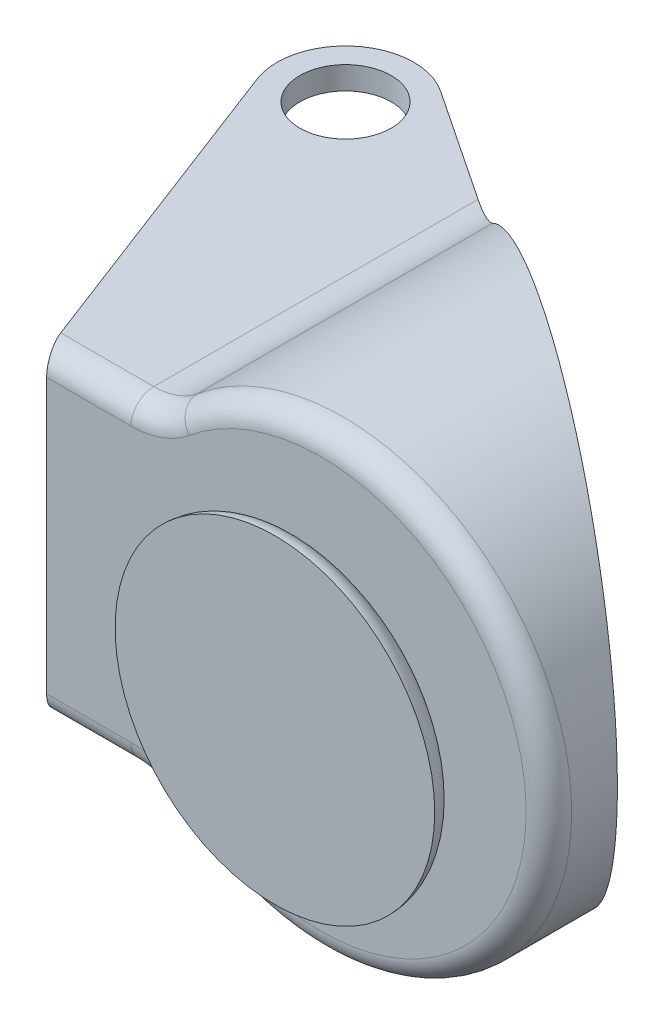
ISO-10303-21;
HEADER;
FILE_DESCRIPTION(('STEP AP214'),'2;1');
FILE_NAME('part.step','',(''),(''),'','','');
FILE_SCHEMA(('AUTOMOTIVE_DESIGN { 1 0 10303 214 1 1 1 1 }'));
ENDSEC;
DATA;
#1=APPLICATION_CONTEXT('core data for automotive mechanical design processes');
#2=APPLICATION_PROTOCOL_DEFINITION('international standard','automotive_design',2000,#1);
#3=PRODUCT_CONTEXT('',#1,'mechanical');
#4=PRODUCT('Part','Part','',(#3));
#5=PRODUCT_RELATED_PRODUCT_CATEGORY('part','',(#4));
#6=PRODUCT_DEFINITION_FORMATION('','',#4);
#7=PRODUCT_DEFINITION_CONTEXT('part definition',#1,'design');
#8=PRODUCT_DEFINITION('design','',#6,#7);
#9=PRODUCT_DEFINITION_SHAPE('','',#8);
#10=(LENGTH_UNIT() NAMED_UNIT(*) SI_UNIT(.MILLI.,.METRE.));
#11=(NAMED_UNIT(*) PLANE_ANGLE_UNIT() SI_UNIT($,.RADIAN.));
#12=(NAMED_UNIT(*) SI_UNIT($,.STERADIAN.) SOLID_ANGLE_UNIT());
#13=UNCERTAINTY_MEASURE_WITH_UNIT(LENGTH_MEASURE(1.E-05),#10,'distance_accuracy_value','');
#14=(GEOMETRIC_REPRESENTATION_CONTEXT(3) GLOBAL_UNCERTAINTY_ASSIGNED_CONTEXT((#13)) GLOBAL_UNIT_ASSIGNED_CONTEXT((#10,
#11,#12)) REPRESENTATION_CONTEXT('',''));
#15=CARTESIAN_POINT('',(0.,0.,0.));
#16=DIRECTION('',(0.,0.,1.));
#17=DIRECTION('',(1.,0.,0.));
#18=AXIS2_PLACEMENT_3D('',#15,#16,#17);
#19=CARTESIAN_POINT('',(0.,0.,17.));
#20=DIRECTION('',(0.,0.,-1.));
#21=DIRECTION('',(-1.,0.,0.));
#22=AXIS2_PLACEMENT_3D('',#19,#20,#21);
#23=CYLINDRICAL_SURFACE('',#22,4.);
#24=CARTESIAN_POINT('',(0.,0.,15.));
#25=DIRECTION('',(0.,0.,1.));
#26=DIRECTION('',(1.,0.,0.));
#27=AXIS2_PLACEMENT_3D('',#24,#25,#26);
#28=CIRCLE('',#27,4.);
#29=CARTESIAN_POINT('',(4.,0.,15.));
#30=VERTEX_POINT('',#29);
#31=EDGE_CURVE('E210',#30,#30,#28,.T.);
#32=ORIENTED_EDGE('',*,*,#31,.T.);
#33=EDGE_LOOP('',(#32));
#34=FACE_BOUND('',#33,.T.);
#35=CARTESIAN_POINT('',(0.,0.,16.));
#36=DIRECTION('',(0.,0.,1.));
#37=DIRECTION('',(1.,0.,0.));
#38=AXIS2_PLACEMENT_3D('',#35,#36,#37);
#39=CIRCLE('',#38,4.);
#40=CARTESIAN_POINT('',(4.,0.,16.));
#41=VERTEX_POINT('',#40);
#42=EDGE_CURVE('E214',#41,#41,#39,.T.);
#43=ORIENTED_EDGE('',*,*,#42,.F.);
#44=EDGE_LOOP('',(#43));
#45=FACE_BOUND('',#44,.T.);
#46=ADVANCED_FACE('F40',(#34,#45),#23,.T.);
#47=CARTESIAN_POINT('',(-14.908326913196,-6.,-1.00000000000003));
#48=DIRECTION('',(0.,1.,0.));
#49=DIRECTION('',(0.,0.,1.));
#50=AXIS2_PLACEMENT_3D('',#47,#48,#49);
#51=PLANE('',#50);
#52=CARTESIAN_POINT('',(-14.908326913196,-6.,-1.00000000000003));
#53=DIRECTION('',(0.,1.,0.));
#54=DIRECTION('',(0.,0.,1.));
#55=AXIS2_PLACEMENT_3D('',#52,#53,#54);
#56=CIRCLE('',#55,2.);
#57=CARTESIAN_POINT('',(-14.908326913196,-6.,0.99999999999997));
#58=VERTEX_POINT('',#57);
#59=EDGE_CURVE('E338',#58,#58,#56,.T.);
#60=ORIENTED_EDGE('',*,*,#59,.F.);
#61=EDGE_LOOP('',(#60));
#62=FACE_BOUND('',#61,.T.);
#63=DIRECTION('',(1.,0.,0.));
#64=VECTOR('',#63,1.);
#65=CARTESIAN_POINT('',(-11.,-6.,14.));
#66=LINE('',#65,#64);
#67=CARTESIAN_POINT('',(-12.3825199412287,-6.,14.));
#68=VERTEX_POINT('',#67);
#69=CARTESIAN_POINT('',(-6.32455532033676,-6.,14.));
#70=VERTEX_POINT('',#69);
#71=EDGE_CURVE('E325',#68,#70,#66,.T.);
#72=ORIENTED_EDGE('',*,*,#71,.T.);
#73=DIRECTION('',(0.,0.,-1.));
#74=VECTOR('',#73,1.);
#75=CARTESIAN_POINT('',(-6.32455532033676,-6.,1.80566491858059));
#76=LINE('',#75,#74);
#77=CARTESIAN_POINT('',(-6.32455532033676,-6.,1.11696311977546));
#78=VERTEX_POINT('',#77);
#79=EDGE_CURVE('E169',#70,#78,#76,.T.);
#80=ORIENTED_EDGE('',*,*,#79,.T.);
#81=DIRECTION('',(-0.832050294337844,0.,-0.554700196225229));
#82=VECTOR('',#81,1.);
#83=CARTESIAN_POINT('',(-13.2442263245203,-6.,-3.49615088301357));
#84=LINE('',#83,#82);
#85=CARTESIAN_POINT('',(-13.2442263245203,-6.,-3.49615088301356));
#86=VERTEX_POINT('',#85);
#87=EDGE_CURVE('E161',#78,#86,#84,.T.);
#88=ORIENTED_EDGE('',*,*,#87,.T.);
#89=CARTESIAN_POINT('',(-14.908326913196,-6.,-1.00000000000003));
#90=DIRECTION('',(0.,1.,0.));
#91=DIRECTION('',(0.,0.,1.));
#92=AXIS2_PLACEMENT_3D('',#89,#90,#91);
#93=CIRCLE('',#92,3.);
#94=CARTESIAN_POINT('',(-17.7103262922765,-6.,0.0718206378086078));
#95=VERTEX_POINT('',#94);
#96=EDGE_CURVE('E166',#86,#95,#93,.T.);
#97=ORIENTED_EDGE('',*,*,#96,.T.);
#98=DIRECTION('',(0.357273545936214,0.,0.933999793026832));
#99=VECTOR('',#98,1.);
#100=CARTESIAN_POINT('',(-12.,-6.,15.));
#101=LINE('',#100,#99);
#102=EDGE_CURVE('E185',#95,#68,#101,.T.);
#103=ORIENTED_EDGE('',*,*,#102,.T.);
#104=EDGE_LOOP('',(#72,#80,#88,#97,#103));
#105=FACE_BOUND('',#104,.T.);
#106=ADVANCED_FACE('F164',(#62,#105),#51,.T.);
#107=CARTESIAN_POINT('',(-14.908326913196,6.,-1.00000000000003));
#108=DIRECTION('',(0.,1.,0.));
#109=DIRECTION('',(0.,0.,1.));
#110=AXIS2_PLACEMENT_3D('',#107,#108,#109);
#111=PLANE('',#110);
#112=CARTESIAN_POINT('',(-14.908326913196,6.,-1.00000000000003));
#113=DIRECTION('',(0.,1.,0.));
#114=DIRECTION('',(0.,0.,1.));
#115=AXIS2_PLACEMENT_3D('',#112,#113,#114);
#116=CIRCLE('',#115,2.);
#117=CARTESIAN_POINT('',(-14.908326913196,6.,0.99999999999997));
#118=VERTEX_POINT('',#117);
#119=EDGE_CURVE('E337',#118,#118,#116,.T.);
#120=ORIENTED_EDGE('',*,*,#119,.T.);
#121=EDGE_LOOP('',(#120));
#122=FACE_BOUND('',#121,.T.);
#123=DIRECTION('',(-0.832050294337844,0.,-0.554700196225229));
#124=VECTOR('',#123,1.);
#125=CARTESIAN_POINT('',(-13.2442263245203,6.,-3.49615088301357));
#126=LINE('',#125,#124);
#127=CARTESIAN_POINT('',(-6.32455532033676,6.,1.11696311977546));
#128=VERTEX_POINT('',#127);
#129=CARTESIAN_POINT('',(-13.2442263245203,6.,-3.49615088301356));
#130=VERTEX_POINT('',#129);
#131=EDGE_CURVE('E342',#128,#130,#126,.T.);
#132=ORIENTED_EDGE('',*,*,#131,.F.);
#133=DIRECTION('',(0.,0.,1.));
#134=VECTOR('',#133,1.);
#135=CARTESIAN_POINT('',(-6.32455532033676,6.,-1.00000000000003));
#136=LINE('',#135,#134);
#137=CARTESIAN_POINT('',(-6.32455532033676,6.,14.));
#138=VERTEX_POINT('',#137);
#139=EDGE_CURVE('E234',#128,#138,#136,.T.);
#140=ORIENTED_EDGE('',*,*,#139,.T.);
#141=DIRECTION('',(1.,0.,0.));
#142=VECTOR('',#141,1.);
#143=CARTESIAN_POINT('',(-11.,6.,14.));
#144=LINE('',#143,#142);
#145=CARTESIAN_POINT('',(-12.3825199412287,6.,14.));
#146=VERTEX_POINT('',#145);
#147=EDGE_CURVE('E333',#146,#138,#144,.T.);
#148=ORIENTED_EDGE('',*,*,#147,.F.);
#149=DIRECTION('',(0.357273545936214,0.,0.933999793026832));
#150=VECTOR('',#149,1.);
#151=CARTESIAN_POINT('',(-12.,6.,15.));
#152=LINE('',#151,#150);
#153=CARTESIAN_POINT('',(-17.7103262922765,6.,0.0718206378086078));
#154=VERTEX_POINT('',#153);
#155=EDGE_CURVE('E174',#154,#146,#152,.T.);
#156=ORIENTED_EDGE('',*,*,#155,.F.);
#157=CARTESIAN_POINT('',(-14.908326913196,6.,-1.00000000000003));
#158=DIRECTION('',(0.,1.,0.));
#159=DIRECTION('',(0.,0.,1.));
#160=AXIS2_PLACEMENT_3D('',#157,#158,#159);
#161=CIRCLE('',#160,3.);
#162=EDGE_CURVE('E351',#130,#154,#161,.T.);
#163=ORIENTED_EDGE('',*,*,#162,.F.);
#164=EDGE_LOOP('',(#132,#140,#148,#156,#163));
#165=FACE_BOUND('',#164,.T.);
#166=ADVANCED_FACE('F409',(#122,#165),#111,.F.);
#167=CARTESIAN_POINT('',(0.,0.,15.));
#168=DIRECTION('',(0.,0.,1.));
#169=DIRECTION('',(1.,0.,0.));
#170=AXIS2_PLACEMENT_3D('',#167,#168,#169);
#171=PLANE('',#170);
#172=DIRECTION('',(0.,-1.,0.));
#173=VECTOR('',#172,1.);
#174=CARTESIAN_POINT('',(-12.,7.,15.));
#175=LINE('',#174,#173);
#176=CARTESIAN_POINT('',(-12.,6.,15.));
#177=VERTEX_POINT('',#176);
#178=CARTESIAN_POINT('',(-12.,-6.,15.));
#179=VERTEX_POINT('',#178);
#180=EDGE_CURVE('E375',#177,#179,#175,.T.);
#181=ORIENTED_EDGE('',*,*,#180,.T.);
#182=DIRECTION('',(1.,0.,0.));
#183=VECTOR('',#182,1.);
#184=CARTESIAN_POINT('',(-8.30662386291808,-6.,15.));
#185=LINE('',#184,#183);
#186=CARTESIAN_POINT('',(-8.30662386291808,-6.,15.));
#187=VERTEX_POINT('',#186);
#188=EDGE_CURVE('E278',#179,#187,#185,.T.);
#189=ORIENTED_EDGE('',*,*,#188,.T.);
#190=CARTESIAN_POINT('',(-8.30662386291808,-10.,15.));
#191=DIRECTION('',(0.,0.,1.));
#192=DIRECTION('',(1.,0.,0.));
#193=AXIS2_PLACEMENT_3D('',#190,#191,#192);
#194=CIRCLE('',#193,4.);
#195=CARTESIAN_POINT('',(-5.75073959740482,-6.92307692307692,15.));
#196=VERTEX_POINT('',#195);
#197=EDGE_CURVE('E275',#187,#196,#194,.F.);
#198=ORIENTED_EDGE('',*,*,#197,.T.);
#199=CARTESIAN_POINT('',(0.,0.,15.));
#200=DIRECTION('',(0.,0.,1.));
#201=DIRECTION('',(1.,0.,0.));
#202=AXIS2_PLACEMENT_3D('',#199,#200,#201);
#203=CIRCLE('',#202,9.);
#204=CARTESIAN_POINT('',(-5.75073959740482,6.92307692307692,15.));
#205=VERTEX_POINT('',#204);
#206=EDGE_CURVE('E266',#196,#205,#203,.T.);
#207=ORIENTED_EDGE('',*,*,#206,.T.);
#208=CARTESIAN_POINT('',(-8.30662386291808,10.,15.));
#209=DIRECTION('',(0.,0.,1.));
#210=DIRECTION('',(1.,0.,0.));
#211=AXIS2_PLACEMENT_3D('',#208,#209,#210);
#212=CIRCLE('',#211,4.);
#213=CARTESIAN_POINT('',(-8.30662386291808,6.,15.));
#214=VERTEX_POINT('',#213);
#215=EDGE_CURVE('E269',#205,#214,#212,.F.);
#216=ORIENTED_EDGE('',*,*,#215,.T.);
#217=DIRECTION('',(1.,0.,0.));
#218=VECTOR('',#217,1.);
#219=CARTESIAN_POINT('',(0.,6.,15.));
#220=LINE('',#219,#218);
#221=EDGE_CURVE('E272',#214,#177,#220,.F.);
#222=ORIENTED_EDGE('',*,*,#221,.T.);
#223=EDGE_LOOP('',(#181,#189,#198,#207,#216,#222));
#224=FACE_BOUND('',#223,.T.);
#225=ORIENTED_EDGE('',*,*,#31,.F.);
#226=EDGE_LOOP('',(#225));
#227=FACE_BOUND('',#226,.T.);
#228=ADVANCED_FACE('F406',(#224,#227),#171,.T.);
#229=CARTESIAN_POINT('',(-14.908326913196,7.,-1.00000000000003));
#230=DIRECTION('',(0.,-1.,0.));
#231=DIRECTION('',(0.,0.,-1.));
#232=AXIS2_PLACEMENT_3D('',#229,#230,#231);
#233=CYLINDRICAL_SURFACE('',#232,3.);
#234=ORIENTED_EDGE('',*,*,#96,.F.);
#235=DIRECTION('',(0.,-1.,0.));
#236=VECTOR('',#235,1.);
#237=CARTESIAN_POINT('',(-13.2442263245203,7.,-3.49615088301356));
#238=LINE('',#237,#236);
#239=CARTESIAN_POINT('',(-13.2442263245203,-7.,-3.49615088301356));
#240=VERTEX_POINT('',#239);
#241=EDGE_CURVE('E181',#86,#240,#238,.T.);
#242=ORIENTED_EDGE('',*,*,#241,.T.);
#243=CARTESIAN_POINT('',(-14.908326913196,-7.,-1.00000000000003));
#244=DIRECTION('',(0.,1.,0.));
#245=DIRECTION('',(0.,0.,1.));
#246=AXIS2_PLACEMENT_3D('',#243,#244,#245);
#247=CIRCLE('',#246,3.);
#248=CARTESIAN_POINT('',(-17.7103262922765,-7.,0.0718206378086078));
#249=VERTEX_POINT('',#248);
#250=EDGE_CURVE('E378',#240,#249,#247,.T.);
#251=ORIENTED_EDGE('',*,*,#250,.T.);
#252=DIRECTION('',(0.,-1.,0.));
#253=VECTOR('',#252,1.);
#254=CARTESIAN_POINT('',(-17.7103262922765,7.,0.0718206378086078));
#255=LINE('',#254,#253);
#256=EDGE_CURVE('E183',#95,#249,#255,.T.);
#257=ORIENTED_EDGE('',*,*,#256,.F.);
#258=EDGE_LOOP('',(#234,#242,#251,#257));
#259=FACE_BOUND('',#258,.T.);
#260=ADVANCED_FACE('F179',(#259),#233,.T.);
#261=CARTESIAN_POINT('',(-14.908326913196,7.,-1.00000000000003));
#262=DIRECTION('',(0.,-1.,0.));
#263=DIRECTION('',(0.,0.,-1.));
#264=AXIS2_PLACEMENT_3D('',#261,#262,#263);
#265=CYLINDRICAL_SURFACE('',#264,2.);
#266=CARTESIAN_POINT('',(-14.908326913196,-7.,-1.00000000000003));
#267=DIRECTION('',(0.,1.,0.));
#268=DIRECTION('',(0.,0.,1.));
#269=AXIS2_PLACEMENT_3D('',#266,#267,#268);
#270=CIRCLE('',#269,2.);
#271=CARTESIAN_POINT('',(-14.908326913196,-7.,0.99999999999997));
#272=VERTEX_POINT('',#271);
#273=EDGE_CURVE('E348',#272,#272,#270,.T.);
#274=ORIENTED_EDGE('',*,*,#273,.F.);
#275=EDGE_LOOP('',(#274));
#276=FACE_BOUND('',#275,.T.);
#277=ORIENTED_EDGE('',*,*,#59,.T.);
#278=EDGE_LOOP('',(#277));
#279=FACE_BOUND('',#278,.T.);
#280=ADVANCED_FACE('F434',(#276,#279),#265,.F.);
#281=CARTESIAN_POINT('',(0.,0.,-986.));
#282=DIRECTION('',(0.,0.,1.));
#283=DIRECTION('',(1.,0.,0.));
#284=AXIS2_PLACEMENT_3D('',#281,#282,#283);
#285=CYLINDRICAL_SURFACE('',#284,8.);
#286=CARTESIAN_POINT('',(0.,0.,5.3333333333333));
#287=DIRECTION('',(-0.554700196225229,0.,0.832050294337844));
#288=DIRECTION('',(0.832050294337844,0.,0.554700196225229));
#289=AXIS2_PLACEMENT_3D('',#286,#287,#288);
#290=ELLIPSE('',#289,9.6148034012373,8.);
#291=CARTESIAN_POINT('',(-4.59967659660856,-6.54545454545454,2.2668822689276));
#292=VERTEX_POINT('',#291);
#293=CARTESIAN_POINT('',(-4.59967659660855,6.54545454545455,2.2668822689276));
#294=VERTEX_POINT('',#293);
#295=EDGE_CURVE('E205',#292,#294,#290,.T.);
#296=ORIENTED_EDGE('',*,*,#295,.F.);
#297=DIRECTION('',(0.,0.,1.));
#298=VECTOR('',#297,1.);
#299=CARTESIAN_POINT('',(-4.59967659660855,-6.54545454545455,-986.));
#300=LINE('',#299,#298);
#301=CARTESIAN_POINT('',(-4.59967659660855,-6.54545454545455,14.));
#302=VERTEX_POINT('',#301);
#303=EDGE_CURVE('E222',#292,#302,#300,.T.);
#304=ORIENTED_EDGE('',*,*,#303,.T.);
#305=CARTESIAN_POINT('',(0.,0.,14.));
#306=DIRECTION('',(0.,0.,1.));
#307=DIRECTION('',(1.,0.,0.));
#308=AXIS2_PLACEMENT_3D('',#305,#306,#307);
#309=CIRCLE('',#308,8.);
#310=CARTESIAN_POINT('',(-4.59967659660855,6.54545454545455,14.));
#311=VERTEX_POINT('',#310);
#312=EDGE_CURVE('E197',#302,#311,#309,.T.);
#313=ORIENTED_EDGE('',*,*,#312,.T.);
#314=DIRECTION('',(0.,0.,1.));
#315=VECTOR('',#314,1.);
#316=CARTESIAN_POINT('',(-4.59967659660855,6.54545454545455,-986.));
#317=LINE('',#316,#315);
#318=EDGE_CURVE('E218',#311,#294,#317,.F.);
#319=ORIENTED_EDGE('',*,*,#318,.T.);
#320=EDGE_LOOP('',(#296,#304,#313,#319));
#321=FACE_BOUND('',#320,.T.);
#322=ADVANCED_FACE('F459',(#321),#285,.F.);
#323=CARTESIAN_POINT('',(0.,0.,14.));
#324=DIRECTION('',(0.,0.,1.));
#325=DIRECTION('',(1.,0.,0.));
#326=AXIS2_PLACEMENT_3D('',#323,#324,#325);
#327=PLANE('',#326);
#328=ORIENTED_EDGE('',*,*,#312,.F.);
#329=CARTESIAN_POINT('',(-6.32455532033676,-9.,14.));
#330=DIRECTION('',(0.,0.,1.));
#331=DIRECTION('',(1.,0.,0.));
#332=AXIS2_PLACEMENT_3D('',#329,#330,#331);
#333=CIRCLE('',#332,3.);
#334=EDGE_CURVE('E250',#302,#70,#333,.T.);
#335=ORIENTED_EDGE('',*,*,#334,.T.);
#336=ORIENTED_EDGE('',*,*,#71,.F.);
#337=DIRECTION('',(0.,1.,0.));
#338=VECTOR('',#337,1.);
#339=CARTESIAN_POINT('',(-12.3825199412287,-6.,14.));
#340=LINE('',#339,#338);
#341=EDGE_CURVE('E319',#68,#146,#340,.T.);
#342=ORIENTED_EDGE('',*,*,#341,.T.);
#343=ORIENTED_EDGE('',*,*,#147,.T.);
#344=CARTESIAN_POINT('',(-6.32455532033676,9.,14.));
#345=DIRECTION('',(0.,0.,1.));
#346=DIRECTION('',(1.,0.,0.));
#347=AXIS2_PLACEMENT_3D('',#344,#345,#346);
#348=CIRCLE('',#347,3.);
#349=EDGE_CURVE('E253',#138,#311,#348,.T.);
#350=ORIENTED_EDGE('',*,*,#349,.T.);
#351=EDGE_LOOP('',(#328,#335,#336,#342,#343,#350));
#352=FACE_BOUND('',#351,.T.);
#353=ADVANCED_FACE('F455',(#352),#327,.F.);
#354=CARTESIAN_POINT('',(0.,0.,14.));
#355=DIRECTION('',(0.,0.,-1.));
#356=DIRECTION('',(-1.,0.,0.));
#357=AXIS2_PLACEMENT_3D('',#354,#355,#356);
#358=CYLINDRICAL_SURFACE('',#357,10.);
#359=DIRECTION('',(0.,0.,-1.));
#360=VECTOR('',#359,1.);
#361=CARTESIAN_POINT('',(-6.38971066378314,7.69230769230769,14.));
#362=LINE('',#361,#360);
#363=CARTESIAN_POINT('',(-6.38971066378314,7.69230769230769,1.07352622414457));
#364=VERTEX_POINT('',#363);
#365=CARTESIAN_POINT('',(-6.38971066378314,7.69230769230769,14.));
#366=VERTEX_POINT('',#365);
#367=EDGE_CURVE('E241',#364,#366,#362,.F.);
#368=ORIENTED_EDGE('',*,*,#367,.T.);
#369=CARTESIAN_POINT('',(0.,0.,14.));
#370=DIRECTION('',(0.,0.,1.));
#371=DIRECTION('',(1.,0.,0.));
#372=AXIS2_PLACEMENT_3D('',#369,#370,#371);
#373=CIRCLE('',#372,10.);
#374=CARTESIAN_POINT('',(-6.38971066378314,-7.69230769230769,14.));
#375=VERTEX_POINT('',#374);
#376=EDGE_CURVE('E11',#366,#375,#373,.F.);
#377=ORIENTED_EDGE('',*,*,#376,.T.);
#378=DIRECTION('',(0.,0.,-1.));
#379=VECTOR('',#378,1.);
#380=CARTESIAN_POINT('',(-6.38971066378314,-7.69230769230769,14.));
#381=LINE('',#380,#379);
#382=CARTESIAN_POINT('',(-6.38971066378314,-7.69230769230769,1.07352622414457));
#383=VERTEX_POINT('',#382);
#384=EDGE_CURVE('E244',#375,#383,#381,.T.);
#385=ORIENTED_EDGE('',*,*,#384,.T.);
#386=CARTESIAN_POINT('',(0.,0.,5.33333333333333));
#387=DIRECTION('',(-0.554700196225229,0.,0.832050294337844));
#388=DIRECTION('',(-0.832050294337844,0.,-0.554700196225229));
#389=AXIS2_PLACEMENT_3D('',#386,#387,#388);
#390=ELLIPSE('',#389,12.0185042515466,10.);
#391=EDGE_CURVE('E206',#383,#364,#390,.T.);
#392=ORIENTED_EDGE('',*,*,#391,.T.);
#393=EDGE_LOOP('',(#368,#377,#385,#392));
#394=FACE_BOUND('',#393,.T.);
#395=ADVANCED_FACE('F458',(#394),#358,.T.);
#396=CARTESIAN_POINT('',(10.,-500.,12.));
#397=DIRECTION('',(-0.554700196225229,0.,0.832050294337844));
#398=DIRECTION('',(0.832050294337844,0.,0.554700196225229));
#399=AXIS2_PLACEMENT_3D('',#396,#397,#398);
#400=PLANE('',#399);
#401=ORIENTED_EDGE('',*,*,#87,.F.);
#402=CARTESIAN_POINT('',(-6.32455532033676,-9.,1.11696311977549));
#403=DIRECTION('',(-0.554700196225229,0.,0.832050294337844));
#404=DIRECTION('',(0.832050294337844,0.,0.554700196225229));
#405=AXIS2_PLACEMENT_3D('',#402,#403,#404);
#406=ELLIPSE('',#405,3.60555127546399,3.);
#407=EDGE_CURVE('E231',#78,#292,#406,.F.);
#408=ORIENTED_EDGE('',*,*,#407,.T.);
#409=ORIENTED_EDGE('',*,*,#295,.T.);
#410=CARTESIAN_POINT('',(-6.32455532033676,9.,1.11696311977549));
#411=DIRECTION('',(-0.554700196225229,0.,0.832050294337844));
#412=DIRECTION('',(0.832050294337844,0.,0.554700196225229));
#413=AXIS2_PLACEMENT_3D('',#410,#411,#412);
#414=ELLIPSE('',#413,3.60555127546399,3.);
#415=EDGE_CURVE('E228',#294,#128,#414,.F.);
#416=ORIENTED_EDGE('',*,*,#415,.T.);
#417=ORIENTED_EDGE('',*,*,#131,.T.);
#418=CARTESIAN_POINT('',(-13.2442263245203,7.,-3.49615088301356));
#419=VERTEX_POINT('',#418);
#420=EDGE_CURVE('E191',#419,#130,#238,.T.);
#421=ORIENTED_EDGE('',*,*,#420,.F.);
#422=DIRECTION('',(-0.832050294337844,0.,-0.554700196225229));
#423=VECTOR('',#422,1.);
#424=CARTESIAN_POINT('',(-13.2442263245203,7.,-3.49615088301357));
#425=LINE('',#424,#423);
#426=CARTESIAN_POINT('',(-8.30662386291808,7.,-0.204415908612087));
#427=VERTEX_POINT('',#426);
#428=EDGE_CURVE('E365',#427,#419,#425,.T.);
#429=ORIENTED_EDGE('',*,*,#428,.F.);
#430=CARTESIAN_POINT('',(-8.30662386291808,10.,-0.204415908612055));
#431=DIRECTION('',(-0.554700196225229,0.,0.832050294337844));
#432=DIRECTION('',(-0.832050294337844,0.,-0.554700196225229));
#433=AXIS2_PLACEMENT_3D('',#430,#431,#432);
#434=ELLIPSE('',#433,3.60555127546399,3.);
#435=EDGE_CURVE('E259',#427,#364,#434,.T.);
#436=ORIENTED_EDGE('',*,*,#435,.T.);
#437=ORIENTED_EDGE('',*,*,#391,.F.);
#438=CARTESIAN_POINT('',(-8.30662386291808,-10.,-0.204415908612055));
#439=DIRECTION('',(-0.554700196225229,0.,0.832050294337844));
#440=DIRECTION('',(-0.832050294337844,0.,-0.554700196225229));
#441=AXIS2_PLACEMENT_3D('',#438,#439,#440);
#442=ELLIPSE('',#441,3.60555127546399,3.);
#443=CARTESIAN_POINT('',(-8.30662386291808,-7.,-0.204415908612087));
#444=VERTEX_POINT('',#443);
#445=EDGE_CURVE('E256',#383,#444,#442,.T.);
#446=ORIENTED_EDGE('',*,*,#445,.T.);
#447=DIRECTION('',(-0.832050294337844,0.,-0.554700196225229));
#448=VECTOR('',#447,1.);
#449=CARTESIAN_POINT('',(-13.2442263245203,-7.,-3.49615088301357));
#450=LINE('',#449,#448);
#451=EDGE_CURVE('E189',#444,#240,#450,.T.);
#452=ORIENTED_EDGE('',*,*,#451,.T.);
#453=ORIENTED_EDGE('',*,*,#241,.F.);
#454=EDGE_LOOP('',(#401,#408,#409,#416,#417,#421,#429,#436,#437,#446,#452,#453));
#455=FACE_BOUND('',#454,.T.);
#456=ADVANCED_FACE('F187',(#455),#400,.F.);
#457=CARTESIAN_POINT('',(-14.908326913196,7.,-1.00000000000003));
#458=DIRECTION('',(0.,1.,0.));
#459=DIRECTION('',(0.,0.,1.));
#460=AXIS2_PLACEMENT_3D('',#457,#458,#459);
#461=PLANE('',#460);
#462=CARTESIAN_POINT('',(-14.908326913196,7.,-1.00000000000003));
#463=DIRECTION('',(0.,1.,0.));
#464=DIRECTION('',(0.,0.,1.));
#465=AXIS2_PLACEMENT_3D('',#462,#463,#464);
#466=CIRCLE('',#465,2.);
#467=CARTESIAN_POINT('',(-14.908326913196,7.,0.99999999999997));
#468=VERTEX_POINT('',#467);
#469=EDGE_CURVE('E358',#468,#468,#466,.T.);
#470=ORIENTED_EDGE('',*,*,#469,.F.);
#471=EDGE_LOOP('',(#470));
#472=FACE_BOUND('',#471,.T.);
#473=DIRECTION('',(0.357273545936214,0.,0.933999793026832));
#474=VECTOR('',#473,1.);
#475=CARTESIAN_POINT('',(-12.,7.,15.));
#476=LINE('',#475,#474);
#477=CARTESIAN_POINT('',(-17.7103262922765,7.,0.0718206378086078));
#478=VERTEX_POINT('',#477);
#479=CARTESIAN_POINT('',(-12.3825199412287,7.,14.));
#480=VERTEX_POINT('',#479);
#481=EDGE_CURVE('E372',#478,#480,#476,.T.);
#482=ORIENTED_EDGE('',*,*,#481,.T.);
#483=DIRECTION('',(1.,0.,0.));
#484=VECTOR('',#483,1.);
#485=CARTESIAN_POINT('',(-14.908326913196,7.,14.));
#486=LINE('',#485,#484);
#487=CARTESIAN_POINT('',(-8.30662386291808,7.,14.));
#488=VERTEX_POINT('',#487);
#489=EDGE_CURVE('E65',#480,#488,#486,.T.);
#490=ORIENTED_EDGE('',*,*,#489,.T.);
#491=DIRECTION('',(0.,0.,-1.));
#492=VECTOR('',#491,1.);
#493=CARTESIAN_POINT('',(-8.30662386291808,7.,-1.00000000000003));
#494=LINE('',#493,#492);
#495=EDGE_CURVE('E247',#488,#427,#494,.T.);
#496=ORIENTED_EDGE('',*,*,#495,.T.);
#497=ORIENTED_EDGE('',*,*,#428,.T.);
#498=CARTESIAN_POINT('',(-14.908326913196,7.,-1.00000000000003));
#499=DIRECTION('',(0.,1.,0.));
#500=DIRECTION('',(0.,0.,1.));
#501=AXIS2_PLACEMENT_3D('',#498,#499,#500);
#502=CIRCLE('',#501,3.);
#503=EDGE_CURVE('E368',#419,#478,#502,.T.);
#504=ORIENTED_EDGE('',*,*,#503,.T.);
#505=EDGE_LOOP('',(#482,#490,#496,#497,#504));
#506=FACE_BOUND('',#505,.T.);
#507=ADVANCED_FACE('F442',(#472,#506),#461,.T.);
#508=CARTESIAN_POINT('',(-14.908326913196,-7.,-1.00000000000003));
#509=DIRECTION('',(0.,1.,0.));
#510=DIRECTION('',(0.,0.,1.));
#511=AXIS2_PLACEMENT_3D('',#508,#509,#510);
#512=PLANE('',#511);
#513=ORIENTED_EDGE('',*,*,#273,.T.);
#514=EDGE_LOOP('',(#513));
#515=FACE_BOUND('',#514,.T.);
#516=DIRECTION('',(0.,0.,1.));
#517=VECTOR('',#516,1.);
#518=CARTESIAN_POINT('',(-8.30662386291808,-7.,15.));
#519=LINE('',#518,#517);
#520=CARTESIAN_POINT('',(-8.30662386291808,-7.,14.));
#521=VERTEX_POINT('',#520);
#522=EDGE_CURVE('E237',#444,#521,#519,.T.);
#523=ORIENTED_EDGE('',*,*,#522,.T.);
#524=DIRECTION('',(1.,0.,0.));
#525=VECTOR('',#524,1.);
#526=CARTESIAN_POINT('',(-12.,-7.,14.));
#527=LINE('',#526,#525);
#528=CARTESIAN_POINT('',(-12.3825199412287,-7.,14.));
#529=VERTEX_POINT('',#528);
#530=EDGE_CURVE('E282',#521,#529,#527,.F.);
#531=ORIENTED_EDGE('',*,*,#530,.T.);
#532=DIRECTION('',(0.357273545936214,0.,0.933999793026832));
#533=VECTOR('',#532,1.);
#534=CARTESIAN_POINT('',(-12.,-7.,15.));
#535=LINE('',#534,#533);
#536=EDGE_CURVE('E369',#249,#529,#535,.T.);
#537=ORIENTED_EDGE('',*,*,#536,.F.);
#538=ORIENTED_EDGE('',*,*,#250,.F.);
#539=ORIENTED_EDGE('',*,*,#451,.F.);
#540=EDGE_LOOP('',(#523,#531,#537,#538,#539));
#541=FACE_BOUND('',#540,.T.);
#542=ADVANCED_FACE('F395',(#515,#541),#512,.F.);
#543=ORIENTED_EDGE('',*,*,#420,.T.);
#544=ORIENTED_EDGE('',*,*,#162,.T.);
#545=EDGE_CURVE('E192',#478,#154,#255,.T.);
#546=ORIENTED_EDGE('',*,*,#545,.F.);
#547=ORIENTED_EDGE('',*,*,#503,.F.);
#548=EDGE_LOOP('',(#543,#544,#546,#547));
#549=FACE_BOUND('',#548,.T.);
#550=ADVANCED_FACE('F448',(#549),#233,.T.);
#551=CARTESIAN_POINT('',(-12.,7.,15.));
#552=DIRECTION('',(0.933999793026832,0.,-0.357273545936214));
#553=DIRECTION('',(-0.357273545936214,0.,-0.933999793026832));
#554=AXIS2_PLACEMENT_3D('',#551,#552,#553);
#555=PLANE('',#554);
#556=ORIENTED_EDGE('',*,*,#536,.T.);
#557=CARTESIAN_POINT('',(-12.3825199412287,-6.,14.));
#558=DIRECTION('',(0.933999793026832,0.,-0.357273545936214));
#559=DIRECTION('',(-0.357273545936214,0.,-0.933999793026832));
#560=AXIS2_PLACEMENT_3D('',#557,#558,#559);
#561=ELLIPSE('',#560,1.07066404882091,1.);
#562=EDGE_CURVE('E288',#529,#179,#561,.F.);
#563=ORIENTED_EDGE('',*,*,#562,.T.);
#564=ORIENTED_EDGE('',*,*,#180,.F.);
#565=CARTESIAN_POINT('',(-12.3825199412287,6.,14.));
#566=DIRECTION('',(0.933999793026832,0.,-0.357273545936214));
#567=DIRECTION('',(0.357273545936214,0.,0.933999793026832));
#568=AXIS2_PLACEMENT_3D('',#565,#566,#567);
#569=ELLIPSE('',#568,1.07066404882091,1.);
#570=EDGE_CURVE('E285',#177,#480,#569,.F.);
#571=ORIENTED_EDGE('',*,*,#570,.T.);
#572=ORIENTED_EDGE('',*,*,#481,.F.);
#573=ORIENTED_EDGE('',*,*,#545,.T.);
#574=ORIENTED_EDGE('',*,*,#155,.T.);
#575=ORIENTED_EDGE('',*,*,#341,.F.);
#576=ORIENTED_EDGE('',*,*,#102,.F.);
#577=ORIENTED_EDGE('',*,*,#256,.T.);
#578=EDGE_LOOP('',(#556,#563,#564,#571,#572,#573,#574,#575,#576,#577));
#579=FACE_BOUND('',#578,.T.);
#580=ADVANCED_FACE('F390',(#579),#555,.F.);
#581=ORIENTED_EDGE('',*,*,#119,.F.);
#582=EDGE_LOOP('',(#581));
#583=FACE_BOUND('',#582,.T.);
#584=ORIENTED_EDGE('',*,*,#469,.T.);
#585=EDGE_LOOP('',(#584));
#586=FACE_BOUND('',#585,.T.);
#587=ADVANCED_FACE('F421',(#583,#586),#265,.F.);
#588=CARTESIAN_POINT('',(0.,0.,16.));
#589=DIRECTION('',(0.,0.,1.));
#590=DIRECTION('',(1.,0.,0.));
#591=AXIS2_PLACEMENT_3D('',#588,#589,#590);
#592=PLANE('',#591);
#593=CARTESIAN_POINT('',(0.,0.,16.));
#594=DIRECTION('',(0.,0.,1.));
#595=DIRECTION('',(1.,0.,0.));
#596=AXIS2_PLACEMENT_3D('',#593,#594,#595);
#597=CIRCLE('',#596,6.);
#598=CARTESIAN_POINT('',(6.,0.,16.));
#599=VERTEX_POINT('',#598);
#600=EDGE_CURVE('E262',#599,#599,#597,.F.);
#601=ORIENTED_EDGE('',*,*,#600,.T.);
#602=EDGE_LOOP('',(#601));
#603=FACE_BOUND('',#602,.T.);
#604=ORIENTED_EDGE('',*,*,#42,.T.);
#605=EDGE_LOOP('',(#604));
#606=FACE_BOUND('',#605,.T.);
#607=ADVANCED_FACE('F418',(#603,#606),#592,.F.);
#608=CARTESIAN_POINT('',(0.,0.,17.));
#609=DIRECTION('',(0.,0.,1.));
#610=DIRECTION('',(1.,0.,0.));
#611=AXIS2_PLACEMENT_3D('',#608,#609,#610);
#612=PLANE('',#611);
#613=CARTESIAN_POINT('',(0.,0.,17.));
#614=DIRECTION('',(0.,0.,1.));
#615=DIRECTION('',(1.,0.,0.));
#616=AXIS2_PLACEMENT_3D('',#613,#614,#615);
#617=CIRCLE('',#616,7.);
#618=CARTESIAN_POINT('',(7.,0.,17.));
#619=VERTEX_POINT('',#618);
#620=EDGE_CURVE('E313',#619,#619,#617,.T.);
#621=ORIENTED_EDGE('',*,*,#620,.T.);
#622=EDGE_LOOP('',(#621));
#623=FACE_BOUND('',#622,.T.);
#624=ADVANCED_FACE('F420',(#623),#612,.T.);
#625=CARTESIAN_POINT('',(-6.32455532033676,-9.,-986.));
#626=DIRECTION('',(0.,0.,1.));
#627=DIRECTION('',(1.,0.,0.));
#628=AXIS2_PLACEMENT_3D('',#625,#626,#627);
#629=CYLINDRICAL_SURFACE('',#628,3.);
#630=ORIENTED_EDGE('',*,*,#407,.F.);
#631=ORIENTED_EDGE('',*,*,#79,.F.);
#632=ORIENTED_EDGE('',*,*,#334,.F.);
#633=ORIENTED_EDGE('',*,*,#303,.F.);
#634=EDGE_LOOP('',(#630,#631,#632,#633));
#635=FACE_BOUND('',#634,.T.);
#636=ADVANCED_FACE('F429',(#635),#629,.T.);
#637=CARTESIAN_POINT('',(-6.32455532033676,9.,-986.));
#638=DIRECTION('',(0.,0.,1.));
#639=DIRECTION('',(1.,0.,0.));
#640=AXIS2_PLACEMENT_3D('',#637,#638,#639);
#641=CYLINDRICAL_SURFACE('',#640,3.);
#642=ORIENTED_EDGE('',*,*,#349,.F.);
#643=ORIENTED_EDGE('',*,*,#139,.F.);
#644=ORIENTED_EDGE('',*,*,#415,.F.);
#645=ORIENTED_EDGE('',*,*,#318,.F.);
#646=EDGE_LOOP('',(#642,#643,#644,#645));
#647=FACE_BOUND('',#646,.T.);
#648=ADVANCED_FACE('F471',(#647),#641,.T.);
#649=CARTESIAN_POINT('',(-8.30662386291808,-10.,14.));
#650=DIRECTION('',(0.,0.,-1.));
#651=DIRECTION('',(-1.,0.,0.));
#652=AXIS2_PLACEMENT_3D('',#649,#650,#651);
#653=CYLINDRICAL_SURFACE('',#652,3.);
#654=ORIENTED_EDGE('',*,*,#384,.F.);
#655=CARTESIAN_POINT('',(-8.30662386291808,-10.,14.));
#656=DIRECTION('',(0.,0.,1.));
#657=DIRECTION('',(1.,0.,0.));
#658=AXIS2_PLACEMENT_3D('',#655,#656,#657);
#659=CIRCLE('',#658,3.);
#660=EDGE_CURVE('E291',#375,#521,#659,.T.);
#661=ORIENTED_EDGE('',*,*,#660,.T.);
#662=ORIENTED_EDGE('',*,*,#522,.F.);
#663=ORIENTED_EDGE('',*,*,#445,.F.);
#664=EDGE_LOOP('',(#654,#661,#662,#663));
#665=FACE_BOUND('',#664,.T.);
#666=ADVANCED_FACE('F475',(#665),#653,.F.);
#667=CARTESIAN_POINT('',(-8.30662386291808,10.,14.));
#668=DIRECTION('',(0.,0.,-1.));
#669=DIRECTION('',(-1.,0.,0.));
#670=AXIS2_PLACEMENT_3D('',#667,#668,#669);
#671=CYLINDRICAL_SURFACE('',#670,3.);
#672=ORIENTED_EDGE('',*,*,#495,.F.);
#673=CARTESIAN_POINT('',(-8.30662386291808,10.,14.));
#674=DIRECTION('',(0.,0.,1.));
#675=DIRECTION('',(1.,0.,0.));
#676=AXIS2_PLACEMENT_3D('',#673,#674,#675);
#677=CIRCLE('',#676,3.);
#678=EDGE_CURVE('E50',#488,#366,#677,.T.);
#679=ORIENTED_EDGE('',*,*,#678,.T.);
#680=ORIENTED_EDGE('',*,*,#367,.F.);
#681=ORIENTED_EDGE('',*,*,#435,.F.);
#682=EDGE_LOOP('',(#672,#679,#680,#681));
#683=FACE_BOUND('',#682,.T.);
#684=ADVANCED_FACE('F479',(#683),#671,.F.);
#685=CARTESIAN_POINT('',(0.,0.,17.));
#686=DIRECTION('',(0.,0.,1.));
#687=DIRECTION('',(1.,0.,0.));
#688=AXIS2_PLACEMENT_3D('',#685,#686,#687);
#689=TOROIDAL_SURFACE('',#688,6.,1.);
#690=ORIENTED_EDGE('',*,*,#600,.F.);
#691=EDGE_LOOP('',(#690));
#692=FACE_BOUND('',#691,.T.);
#693=ORIENTED_EDGE('',*,*,#620,.F.);
#694=EDGE_LOOP('',(#693));
#695=FACE_BOUND('',#694,.T.);
#696=ADVANCED_FACE('F483',(#692,#695),#689,.T.);
#697=CARTESIAN_POINT('',(-14.908326913196,6.,14.));
#698=DIRECTION('',(1.,0.,0.));
#699=DIRECTION('',(0.,0.,-1.));
#700=AXIS2_PLACEMENT_3D('',#697,#698,#699);
#701=CYLINDRICAL_SURFACE('',#700,1.);
#702=ORIENTED_EDGE('',*,*,#570,.F.);
#703=ORIENTED_EDGE('',*,*,#221,.F.);
#704=CARTESIAN_POINT('',(-8.30662386291808,6.,14.));
#705=DIRECTION('',(1.,0.,0.));
#706=DIRECTION('',(0.,0.,-1.));
#707=AXIS2_PLACEMENT_3D('',#704,#705,#706);
#708=CIRCLE('',#707,1.);
#709=EDGE_CURVE('E44',#488,#214,#708,.T.);
#710=ORIENTED_EDGE('',*,*,#709,.F.);
#711=ORIENTED_EDGE('',*,*,#489,.F.);
#712=EDGE_LOOP('',(#702,#703,#710,#711));
#713=FACE_BOUND('',#712,.T.);
#714=ADVANCED_FACE('F42',(#713),#701,.T.);
#715=CARTESIAN_POINT('',(-8.30662386291808,10.,14.));
#716=DIRECTION('',(0.,0.,1.));
#717=DIRECTION('',(1.,0.,0.));
#718=AXIS2_PLACEMENT_3D('',#715,#716,#717);
#719=TOROIDAL_SURFACE('',#718,4.,1.);
#720=ORIENTED_EDGE('',*,*,#709,.T.);
#721=ORIENTED_EDGE('',*,*,#215,.F.);
#722=CARTESIAN_POINT('',(-5.75073959740482,6.92307692307692,14.));
#723=DIRECTION('',(0.769230769230769,0.638971066378314,0.));
#724=DIRECTION('',(-0.638971066378314,0.769230769230769,0.));
#725=AXIS2_PLACEMENT_3D('',#722,#723,#724);
#726=CIRCLE('',#725,1.);
#727=EDGE_CURVE('E304',#366,#205,#726,.T.);
#728=ORIENTED_EDGE('',*,*,#727,.F.);
#729=ORIENTED_EDGE('',*,*,#678,.F.);
#730=EDGE_LOOP('',(#720,#721,#728,#729));
#731=FACE_BOUND('',#730,.T.);
#732=ADVANCED_FACE('F493',(#731),#719,.T.);
#733=CARTESIAN_POINT('',(0.,0.,14.));
#734=DIRECTION('',(0.,0.,1.));
#735=DIRECTION('',(1.,0.,0.));
#736=AXIS2_PLACEMENT_3D('',#733,#734,#735);
#737=TOROIDAL_SURFACE('',#736,9.,1.);
#738=ORIENTED_EDGE('',*,*,#727,.T.);
#739=ORIENTED_EDGE('',*,*,#206,.F.);
#740=CARTESIAN_POINT('',(-5.75073959740482,-6.92307692307692,14.));
#741=DIRECTION('',(-0.769230769230769,0.638971066378314,0.));
#742=DIRECTION('',(-0.638971066378314,-0.769230769230769,0.));
#743=AXIS2_PLACEMENT_3D('',#740,#741,#742);
#744=CIRCLE('',#743,1.);
#745=EDGE_CURVE('E301',#375,#196,#744,.T.);
#746=ORIENTED_EDGE('',*,*,#745,.F.);
#747=ORIENTED_EDGE('',*,*,#376,.F.);
#748=EDGE_LOOP('',(#738,#739,#746,#747));
#749=FACE_BOUND('',#748,.T.);
#750=ADVANCED_FACE('F491',(#749),#737,.T.);
#751=CARTESIAN_POINT('',(-8.30662386291808,-10.,14.));
#752=DIRECTION('',(0.,0.,1.));
#753=DIRECTION('',(1.,0.,0.));
#754=AXIS2_PLACEMENT_3D('',#751,#752,#753);
#755=TOROIDAL_SURFACE('',#754,4.,1.);
#756=ORIENTED_EDGE('',*,*,#745,.T.);
#757=ORIENTED_EDGE('',*,*,#197,.F.);
#758=CARTESIAN_POINT('',(-8.30662386291808,-6.,14.));
#759=DIRECTION('',(-1.,0.,0.));
#760=DIRECTION('',(0.,0.,1.));
#761=AXIS2_PLACEMENT_3D('',#758,#759,#760);
#762=CIRCLE('',#761,1.);
#763=EDGE_CURVE('E298',#521,#187,#762,.T.);
#764=ORIENTED_EDGE('',*,*,#763,.F.);
#765=ORIENTED_EDGE('',*,*,#660,.F.);
#766=EDGE_LOOP('',(#756,#757,#764,#765));
#767=FACE_BOUND('',#766,.T.);
#768=ADVANCED_FACE('F404',(#767),#755,.T.);
#769=CARTESIAN_POINT('',(0.,-6.,14.));
#770=DIRECTION('',(-1.,0.,0.));
#771=DIRECTION('',(0.,0.,1.));
#772=AXIS2_PLACEMENT_3D('',#769,#770,#771);
#773=CYLINDRICAL_SURFACE('',#772,1.);
#774=ORIENTED_EDGE('',*,*,#562,.F.);
#775=ORIENTED_EDGE('',*,*,#530,.F.);
#776=ORIENTED_EDGE('',*,*,#763,.T.);
#777=ORIENTED_EDGE('',*,*,#188,.F.);
#778=EDGE_LOOP('',(#774,#775,#776,#777));
#779=FACE_BOUND('',#778,.T.);
#780=ADVANCED_FACE('F400',(#779),#773,.T.);
#781=CLOSED_SHELL('',(#46,#106,#166,#228,#260,#280,#322,#353,#395,#456,#507,#542,#550,#580,#587,
#607,#624,#636,#648,#666,#684,#696,#714,#732,#750,#768,#780));
#782=MANIFOLD_SOLID_BREP('B2',#781);
#783=ADVANCED_BREP_SHAPE_REPRESENTATION('',(#18,#782),#14);
#784=SHAPE_DEFINITION_REPRESENTATION(#9,#783);
ENDSEC;
END-ISO-10303-21;
